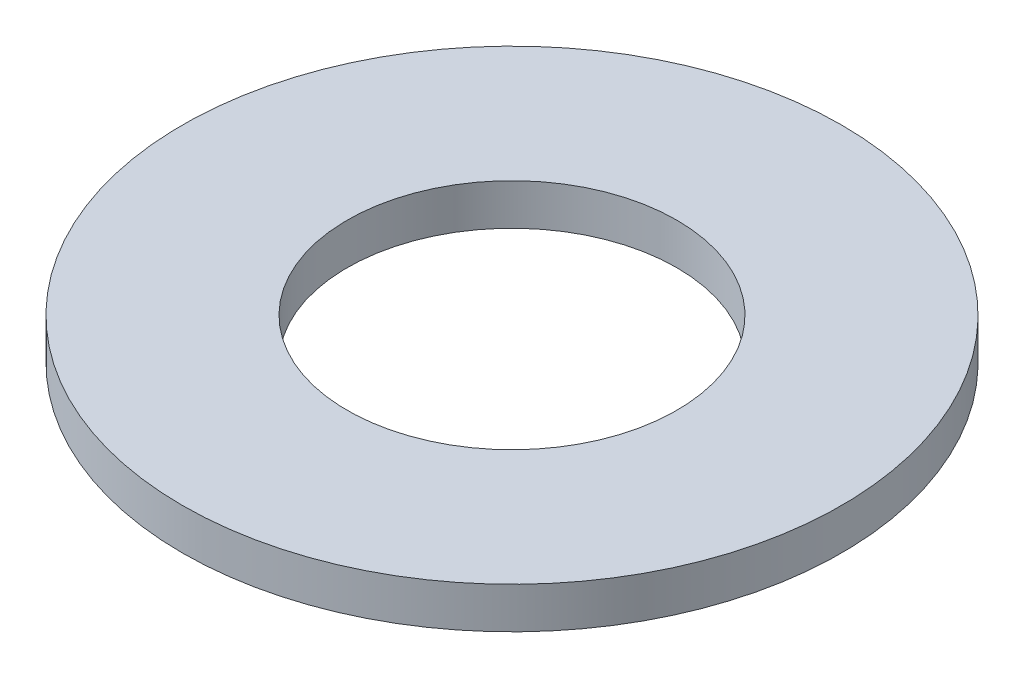
ISO-10303-21;
HEADER;
FILE_DESCRIPTION(('STEP AP214'),'2;1');
FILE_NAME('part.step','',(''),(''),'','','');
FILE_SCHEMA(('AUTOMOTIVE_DESIGN { 1 0 10303 214 1 1 1 1 }'));
ENDSEC;
DATA;
#1=APPLICATION_CONTEXT('core data for automotive mechanical design processes');
#2=APPLICATION_PROTOCOL_DEFINITION('international standard','automotive_design',2000,#1);
#3=PRODUCT_CONTEXT('',#1,'mechanical');
#4=PRODUCT('Part','Part','',(#3));
#5=PRODUCT_RELATED_PRODUCT_CATEGORY('part','',(#4));
#6=PRODUCT_DEFINITION_FORMATION('','',#4);
#7=PRODUCT_DEFINITION_CONTEXT('part definition',#1,'design');
#8=PRODUCT_DEFINITION('design','',#6,#7);
#9=PRODUCT_DEFINITION_SHAPE('','',#8);
#10=(LENGTH_UNIT() NAMED_UNIT(*) SI_UNIT(.MILLI.,.METRE.));
#11=(NAMED_UNIT(*) PLANE_ANGLE_UNIT() SI_UNIT($,.RADIAN.));
#12=(NAMED_UNIT(*) SI_UNIT($,.STERADIAN.) SOLID_ANGLE_UNIT());
#13=UNCERTAINTY_MEASURE_WITH_UNIT(LENGTH_MEASURE(1.E-05),#10,'distance_accuracy_value','');
#14=(GEOMETRIC_REPRESENTATION_CONTEXT(3) GLOBAL_UNCERTAINTY_ASSIGNED_CONTEXT((#13)) GLOBAL_UNIT_ASSIGNED_CONTEXT((#10,
#11,#12)) REPRESENTATION_CONTEXT('',''));
#15=CARTESIAN_POINT('',(0.,0.,0.));
#16=DIRECTION('',(0.,0.,1.));
#17=DIRECTION('',(1.,0.,0.));
#18=AXIS2_PLACEMENT_3D('',#15,#16,#17);
#19=CARTESIAN_POINT('',(0.,0.,0.));
#20=DIRECTION('',(0.,-1.,0.));
#21=DIRECTION('',(0.,0.,-1.));
#22=AXIS2_PLACEMENT_3D('',#19,#20,#21);
#23=CYLINDRICAL_SURFACE('',#22,8.);
#24=CARTESIAN_POINT('',(0.,0.,0.));
#25=DIRECTION('',(0.,-1.,0.));
#26=DIRECTION('',(0.,0.,-1.));
#27=AXIS2_PLACEMENT_3D('',#24,#25,#26);
#28=CIRCLE('',#27,8.);
#29=CARTESIAN_POINT('',(0.,0.,-8.));
#30=VERTEX_POINT('',#29);
#31=EDGE_CURVE('E10',#30,#30,#28,.T.);
#32=ORIENTED_EDGE('',*,*,#31,.T.);
#33=EDGE_LOOP('',(#32));
#34=FACE_BOUND('',#33,.T.);
#35=CARTESIAN_POINT('',(0.,2.,0.));
#36=DIRECTION('',(0.,-1.,0.));
#37=DIRECTION('',(0.,0.,-1.));
#38=AXIS2_PLACEMENT_3D('',#35,#36,#37);
#39=CIRCLE('',#38,8.);
#40=CARTESIAN_POINT('',(0.,2.,-8.));
#41=VERTEX_POINT('',#40);
#42=EDGE_CURVE('E44',#41,#41,#39,.T.);
#43=ORIENTED_EDGE('',*,*,#42,.F.);
#44=EDGE_LOOP('',(#43));
#45=FACE_BOUND('',#44,.T.);
#46=ADVANCED_FACE('F30',(#34,#45),#23,.F.);
#47=CARTESIAN_POINT('',(8.,0.,0.));
#48=DIRECTION('',(0.,-1.,0.));
#49=DIRECTION('',(0.,0.,-1.));
#50=AXIS2_PLACEMENT_3D('',#47,#48,#49);
#51=PLANE('',#50);
#52=CARTESIAN_POINT('',(0.,0.,0.));
#53=DIRECTION('',(0.,-1.,0.));
#54=DIRECTION('',(0.,0.,-1.));
#55=AXIS2_PLACEMENT_3D('',#52,#53,#54);
#56=CIRCLE('',#55,16.);
#57=CARTESIAN_POINT('',(0.,0.,-16.));
#58=VERTEX_POINT('',#57);
#59=EDGE_CURVE('E36',#58,#58,#56,.T.);
#60=ORIENTED_EDGE('',*,*,#59,.T.);
#61=EDGE_LOOP('',(#60));
#62=FACE_BOUND('',#61,.T.);
#63=ORIENTED_EDGE('',*,*,#31,.F.);
#64=EDGE_LOOP('',(#63));
#65=FACE_BOUND('',#64,.T.);
#66=ADVANCED_FACE('F54',(#62,#65),#51,.T.);
#67=CARTESIAN_POINT('',(0.,0.,0.));
#68=DIRECTION('',(0.,-1.,0.));
#69=DIRECTION('',(0.,0.,-1.));
#70=AXIS2_PLACEMENT_3D('',#67,#68,#69);
#71=CYLINDRICAL_SURFACE('',#70,16.);
#72=CARTESIAN_POINT('',(0.,2.,0.));
#73=DIRECTION('',(0.,-1.,0.));
#74=DIRECTION('',(0.,0.,-1.));
#75=AXIS2_PLACEMENT_3D('',#72,#73,#74);
#76=CIRCLE('',#75,16.);
#77=CARTESIAN_POINT('',(0.,2.,-16.));
#78=VERTEX_POINT('',#77);
#79=EDGE_CURVE('E40',#78,#78,#76,.T.);
#80=ORIENTED_EDGE('',*,*,#79,.T.);
#81=EDGE_LOOP('',(#80));
#82=FACE_BOUND('',#81,.T.);
#83=ORIENTED_EDGE('',*,*,#59,.F.);
#84=EDGE_LOOP('',(#83));
#85=FACE_BOUND('',#84,.T.);
#86=ADVANCED_FACE('F58',(#82,#85),#71,.T.);
#87=CARTESIAN_POINT('',(16.,2.,0.));
#88=DIRECTION('',(0.,1.,0.));
#89=DIRECTION('',(0.,0.,1.));
#90=AXIS2_PLACEMENT_3D('',#87,#88,#89);
#91=PLANE('',#90);
#92=ORIENTED_EDGE('',*,*,#42,.T.);
#93=EDGE_LOOP('',(#92));
#94=FACE_BOUND('',#93,.T.);
#95=ORIENTED_EDGE('',*,*,#79,.F.);
#96=EDGE_LOOP('',(#95));
#97=FACE_BOUND('',#96,.T.);
#98=ADVANCED_FACE('F50',(#94,#97),#91,.T.);
#99=CLOSED_SHELL('',(#46,#66,#86,#98));
#100=MANIFOLD_SOLID_BREP('B2',#99);
#101=ADVANCED_BREP_SHAPE_REPRESENTATION('',(#18,#100),#14);
#102=SHAPE_DEFINITION_REPRESENTATION(#9,#101);
ENDSEC;
END-ISO-10303-21;
